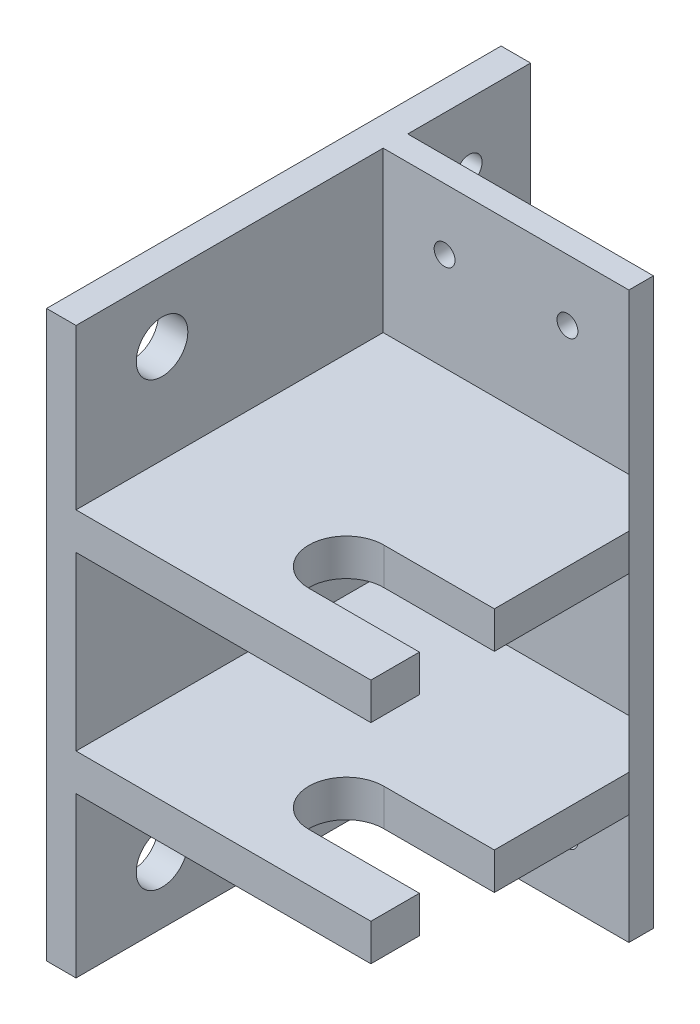
ISO-10303-21;
HEADER;
FILE_DESCRIPTION(('STEP AP214'),'2;1');
FILE_NAME('part.step','',(''),(''),'','','');
FILE_SCHEMA(('AUTOMOTIVE_DESIGN { 1 0 10303 214 1 1 1 1 }'));
ENDSEC;
DATA;
#1=APPLICATION_CONTEXT('core data for automotive mechanical design processes');
#2=APPLICATION_PROTOCOL_DEFINITION('international standard','automotive_design',2000,#1);
#3=PRODUCT_CONTEXT('',#1,'mechanical');
#4=PRODUCT('Part','Part','',(#3));
#5=PRODUCT_RELATED_PRODUCT_CATEGORY('part','',(#4));
#6=PRODUCT_DEFINITION_FORMATION('','',#4);
#7=PRODUCT_DEFINITION_CONTEXT('part definition',#1,'design');
#8=PRODUCT_DEFINITION('design','',#6,#7);
#9=PRODUCT_DEFINITION_SHAPE('','',#8);
#10=(LENGTH_UNIT() NAMED_UNIT(*) SI_UNIT(.MILLI.,.METRE.));
#11=(NAMED_UNIT(*) PLANE_ANGLE_UNIT() SI_UNIT($,.RADIAN.));
#12=(NAMED_UNIT(*) SI_UNIT($,.STERADIAN.) SOLID_ANGLE_UNIT());
#13=UNCERTAINTY_MEASURE_WITH_UNIT(LENGTH_MEASURE(1.E-05),#10,'distance_accuracy_value','');
#14=(GEOMETRIC_REPRESENTATION_CONTEXT(3) GLOBAL_UNCERTAINTY_ASSIGNED_CONTEXT((#13)) GLOBAL_UNIT_ASSIGNED_CONTEXT((#10,
#11,#12)) REPRESENTATION_CONTEXT('',''));
#15=CARTESIAN_POINT('',(0.,0.,0.));
#16=DIRECTION('',(0.,0.,1.));
#17=DIRECTION('',(1.,0.,0.));
#18=AXIS2_PLACEMENT_3D('',#15,#16,#17);
#19=CARTESIAN_POINT('',(120.,-35.,135.));
#20=DIRECTION('',(-1.,0.,0.));
#21=DIRECTION('',(0.,-1.,0.));
#22=AXIS2_PLACEMENT_3D('',#19,#20,#21);
#23=PLANE('',#22);
#24=DIRECTION('',(0.,0.,-1.));
#25=VECTOR('',#24,1.);
#26=CARTESIAN_POINT('',(120.,-50.,135.));
#27=LINE('',#26,#25);
#28=CARTESIAN_POINT('',(120.,-50.,135.));
#29=VERTEX_POINT('',#28);
#30=CARTESIAN_POINT('',(120.,-50.,115.25));
#31=VERTEX_POINT('',#30);
#32=EDGE_CURVE('E318',#29,#31,#27,.T.);
#33=ORIENTED_EDGE('',*,*,#32,.T.);
#34=DIRECTION('',(0.,1.,0.));
#35=VECTOR('',#34,1.);
#36=CARTESIAN_POINT('',(120.,-115.00005,115.25));
#37=LINE('',#36,#35);
#38=CARTESIAN_POINT('',(120.,-35.,115.25));
#39=VERTEX_POINT('',#38);
#40=EDGE_CURVE('E253',#31,#39,#37,.T.);
#41=ORIENTED_EDGE('',*,*,#40,.T.);
#42=DIRECTION('',(0.,0.,1.));
#43=VECTOR('',#42,1.);
#44=CARTESIAN_POINT('',(120.,-35.,135.));
#45=LINE('',#44,#43);
#46=CARTESIAN_POINT('',(120.,-35.,135.));
#47=VERTEX_POINT('',#46);
#48=EDGE_CURVE('E321',#39,#47,#45,.T.);
#49=ORIENTED_EDGE('',*,*,#48,.T.);
#50=DIRECTION('',(0.,-1.,0.));
#51=VECTOR('',#50,1.);
#52=CARTESIAN_POINT('',(120.,-50.,135.));
#53=LINE('',#52,#51);
#54=EDGE_CURVE('E313',#47,#29,#53,.T.);
#55=ORIENTED_EDGE('',*,*,#54,.T.);
#56=EDGE_LOOP('',(#33,#41,#49,#55));
#57=FACE_BOUND('',#56,.T.);
#58=ADVANCED_FACE('F37',(#57),#23,.F.);
#59=CARTESIAN_POINT('',(120.,50.,135.));
#60=DIRECTION('',(-1.,0.,0.));
#61=DIRECTION('',(0.,-1.,0.));
#62=AXIS2_PLACEMENT_3D('',#59,#60,#61);
#63=PLANE('',#62);
#64=DIRECTION('',(0.,0.,-1.));
#65=VECTOR('',#64,1.);
#66=CARTESIAN_POINT('',(120.,35.,135.));
#67=LINE('',#66,#65);
#68=CARTESIAN_POINT('',(120.,35.,135.));
#69=VERTEX_POINT('',#68);
#70=CARTESIAN_POINT('',(120.,35.,115.25));
#71=VERTEX_POINT('',#70);
#72=EDGE_CURVE('E295',#69,#71,#67,.T.);
#73=ORIENTED_EDGE('',*,*,#72,.T.);
#74=DIRECTION('',(0.,1.,0.));
#75=VECTOR('',#74,1.);
#76=CARTESIAN_POINT('',(120.,50.,115.25));
#77=LINE('',#76,#75);
#78=CARTESIAN_POINT('',(120.,50.,115.25));
#79=VERTEX_POINT('',#78);
#80=EDGE_CURVE('E234',#71,#79,#77,.T.);
#81=ORIENTED_EDGE('',*,*,#80,.T.);
#82=DIRECTION('',(0.,0.,1.));
#83=VECTOR('',#82,1.);
#84=CARTESIAN_POINT('',(120.,50.,135.));
#85=LINE('',#84,#83);
#86=CARTESIAN_POINT('',(120.,50.,135.));
#87=VERTEX_POINT('',#86);
#88=EDGE_CURVE('E224',#79,#87,#85,.T.);
#89=ORIENTED_EDGE('',*,*,#88,.T.);
#90=DIRECTION('',(0.,-1.,0.));
#91=VECTOR('',#90,1.);
#92=CARTESIAN_POINT('',(120.,35.,135.));
#93=LINE('',#92,#91);
#94=EDGE_CURVE('E290',#87,#69,#93,.T.);
#95=ORIENTED_EDGE('',*,*,#94,.T.);
#96=EDGE_LOOP('',(#73,#81,#89,#95));
#97=FACE_BOUND('',#96,.T.);
#98=ADVANCED_FACE('F575',(#97),#63,.F.);
#99=CARTESIAN_POINT('',(44.,-199.122877778689,10.));
#100=DIRECTION('',(0.,0.,1.));
#101=DIRECTION('',(1.,0.,0.));
#102=AXIS2_PLACEMENT_3D('',#99,#100,#101);
#103=PLANE('',#102);
#104=CARTESIAN_POINT('',(75.,0.,10.));
#105=DIRECTION('',(0.,0.,1.));
#106=DIRECTION('',(1.,0.,0.));
#107=AXIS2_PLACEMENT_3D('',#104,#105,#106);
#108=CIRCLE('',#107,4.25);
#109=CARTESIAN_POINT('',(79.25,0.,10.));
#110=VERTEX_POINT('',#109);
#111=EDGE_CURVE('E491',#110,#110,#108,.T.);
#112=ORIENTED_EDGE('',*,*,#111,.F.);
#113=EDGE_LOOP('',(#112));
#114=FACE_BOUND('',#113,.T.);
#115=CARTESIAN_POINT('',(25.,0.,10.));
#116=DIRECTION('',(0.,0.,1.));
#117=DIRECTION('',(1.,0.,0.));
#118=AXIS2_PLACEMENT_3D('',#115,#116,#117);
#119=CIRCLE('',#118,4.25);
#120=CARTESIAN_POINT('',(29.25,0.,10.));
#121=VERTEX_POINT('',#120);
#122=EDGE_CURVE('E490',#121,#121,#119,.T.);
#123=ORIENTED_EDGE('',*,*,#122,.F.);
#124=EDGE_LOOP('',(#123));
#125=FACE_BOUND('',#124,.T.);
#126=DIRECTION('',(0.,1.,0.));
#127=VECTOR('',#126,1.);
#128=CARTESIAN_POINT('',(100.,-199.122877778689,10.));
#129=LINE('',#128,#127);
#130=CARTESIAN_POINT('',(100.,-35.,10.));
#131=VERTEX_POINT('',#130);
#132=CARTESIAN_POINT('',(100.,35.,10.));
#133=VERTEX_POINT('',#132);
#134=EDGE_CURVE('E446',#131,#133,#129,.T.);
#135=ORIENTED_EDGE('',*,*,#134,.T.);
#136=DIRECTION('',(-1.,0.,0.));
#137=VECTOR('',#136,1.);
#138=CARTESIAN_POINT('',(120.,35.,10.));
#139=LINE('',#138,#137);
#140=CARTESIAN_POINT('',(0.,35.,10.));
#141=VERTEX_POINT('',#140);
#142=EDGE_CURVE('E307',#133,#141,#139,.T.);
#143=ORIENTED_EDGE('',*,*,#142,.T.);
#144=DIRECTION('',(0.,-1.,0.));
#145=VECTOR('',#144,1.);
#146=CARTESIAN_POINT('',(0.,-199.122877778689,10.));
#147=LINE('',#146,#145);
#148=CARTESIAN_POINT('',(0.,-35.,10.));
#149=VERTEX_POINT('',#148);
#150=EDGE_CURVE('E420',#141,#149,#147,.T.);
#151=ORIENTED_EDGE('',*,*,#150,.T.);
#152=DIRECTION('',(-1.,0.,0.));
#153=VECTOR('',#152,1.);
#154=CARTESIAN_POINT('',(120.,-35.,10.));
#155=LINE('',#154,#153);
#156=EDGE_CURVE('E331',#131,#149,#155,.T.);
#157=ORIENTED_EDGE('',*,*,#156,.F.);
#158=EDGE_LOOP('',(#135,#143,#151,#157));
#159=FACE_BOUND('',#158,.T.);
#160=ADVANCED_FACE('F465',(#114,#125,#159),#103,.T.);
#161=CARTESIAN_POINT('',(75.,90.,10.));
#162=DIRECTION('',(0.,0.,1.));
#163=DIRECTION('',(1.,0.,0.));
#164=AXIS2_PLACEMENT_3D('',#161,#162,#163);
#165=CIRCLE('',#164,4.25);
#166=CARTESIAN_POINT('',(79.25,90.,10.));
#167=VERTEX_POINT('',#166);
#168=EDGE_CURVE('E499',#167,#167,#165,.T.);
#169=ORIENTED_EDGE('',*,*,#168,.F.);
#170=EDGE_LOOP('',(#169));
#171=FACE_BOUND('',#170,.T.);
#172=CARTESIAN_POINT('',(25.,90.,10.));
#173=DIRECTION('',(0.,0.,1.));
#174=DIRECTION('',(1.,0.,0.));
#175=AXIS2_PLACEMENT_3D('',#172,#173,#174);
#176=CIRCLE('',#175,4.25);
#177=CARTESIAN_POINT('',(29.25,90.,10.));
#178=VERTEX_POINT('',#177);
#179=EDGE_CURVE('E495',#178,#178,#176,.T.);
#180=ORIENTED_EDGE('',*,*,#179,.F.);
#181=EDGE_LOOP('',(#180));
#182=FACE_BOUND('',#181,.T.);
#183=CARTESIAN_POINT('',(0.,115.,10.));
#184=VERTEX_POINT('',#183);
#185=CARTESIAN_POINT('',(0.,50.,10.));
#186=VERTEX_POINT('',#185);
#187=EDGE_CURVE('E428',#184,#186,#147,.T.);
#188=ORIENTED_EDGE('',*,*,#187,.T.);
#189=DIRECTION('',(-1.,0.,0.));
#190=VECTOR('',#189,1.);
#191=CARTESIAN_POINT('',(120.,50.,10.));
#192=LINE('',#191,#190);
#193=CARTESIAN_POINT('',(100.,50.,10.));
#194=VERTEX_POINT('',#193);
#195=EDGE_CURVE('E304',#194,#186,#192,.T.);
#196=ORIENTED_EDGE('',*,*,#195,.F.);
#197=CARTESIAN_POINT('',(100.,115.,10.));
#198=VERTEX_POINT('',#197);
#199=EDGE_CURVE('E436',#194,#198,#129,.T.);
#200=ORIENTED_EDGE('',*,*,#199,.T.);
#201=DIRECTION('',(-1.,0.,0.));
#202=VECTOR('',#201,1.);
#203=CARTESIAN_POINT('',(44.,115.,10.));
#204=LINE('',#203,#202);
#205=EDGE_CURVE('E421',#198,#184,#204,.T.);
#206=ORIENTED_EDGE('',*,*,#205,.T.);
#207=EDGE_LOOP('',(#188,#196,#200,#206));
#208=FACE_BOUND('',#207,.T.);
#209=ADVANCED_FACE('F581',(#171,#182,#208),#103,.T.);
#210=CARTESIAN_POINT('',(0.,-199.122877778689,-50.));
#211=DIRECTION('',(-1.,0.,0.));
#212=DIRECTION('',(0.,-1.,0.));
#213=AXIS2_PLACEMENT_3D('',#210,#211,#212);
#214=PLANE('',#213);
#215=DIRECTION('',(0.,0.,-1.));
#216=VECTOR('',#215,1.);
#217=CARTESIAN_POINT('',(0.,35.,135.));
#218=LINE('',#217,#216);
#219=CARTESIAN_POINT('',(0.,35.,135.));
#220=VERTEX_POINT('',#219);
#221=EDGE_CURVE('E289',#220,#141,#218,.T.);
#222=ORIENTED_EDGE('',*,*,#221,.F.);
#223=DIRECTION('',(0.,-1.,0.));
#224=VECTOR('',#223,1.);
#225=CARTESIAN_POINT('',(0.,-199.122877778689,135.));
#226=LINE('',#225,#224);
#227=CARTESIAN_POINT('',(0.,-35.,135.));
#228=VERTEX_POINT('',#227);
#229=EDGE_CURVE('E345',#220,#228,#226,.T.);
#230=ORIENTED_EDGE('',*,*,#229,.T.);
#231=DIRECTION('',(0.,0.,1.));
#232=VECTOR('',#231,1.);
#233=CARTESIAN_POINT('',(0.,-35.,135.));
#234=LINE('',#233,#232);
#235=EDGE_CURVE('E317',#149,#228,#234,.T.);
#236=ORIENTED_EDGE('',*,*,#235,.F.);
#237=ORIENTED_EDGE('',*,*,#150,.F.);
#238=EDGE_LOOP('',(#222,#230,#236,#237));
#239=FACE_BOUND('',#238,.T.);
#240=ADVANCED_FACE('F472',(#239),#214,.F.);
#241=CARTESIAN_POINT('',(0.,90.,100.));
#242=DIRECTION('',(1.,0.,0.));
#243=DIRECTION('',(0.,0.,-1.));
#244=AXIS2_PLACEMENT_3D('',#241,#242,#243);
#245=CIRCLE('',#244,10.5);
#246=CARTESIAN_POINT('',(0.,90.,89.5));
#247=VERTEX_POINT('',#246);
#248=EDGE_CURVE('E246',#247,#247,#245,.T.);
#249=ORIENTED_EDGE('',*,*,#248,.F.);
#250=EDGE_LOOP('',(#249));
#251=FACE_BOUND('',#250,.T.);
#252=DIRECTION('',(0.,0.,1.));
#253=VECTOR('',#252,1.);
#254=CARTESIAN_POINT('',(0.,50.,135.));
#255=LINE('',#254,#253);
#256=CARTESIAN_POINT('',(0.,50.,135.));
#257=VERTEX_POINT('',#256);
#258=EDGE_CURVE('E294',#186,#257,#255,.T.);
#259=ORIENTED_EDGE('',*,*,#258,.F.);
#260=ORIENTED_EDGE('',*,*,#187,.F.);
#261=DIRECTION('',(0.,0.,1.));
#262=VECTOR('',#261,1.);
#263=CARTESIAN_POINT('',(0.,115.,-50.));
#264=LINE('',#263,#262);
#265=CARTESIAN_POINT('',(0.,115.,135.));
#266=VERTEX_POINT('',#265);
#267=EDGE_CURVE('E364',#184,#266,#264,.T.);
#268=ORIENTED_EDGE('',*,*,#267,.T.);
#269=EDGE_CURVE('E342',#266,#257,#226,.T.);
#270=ORIENTED_EDGE('',*,*,#269,.T.);
#271=EDGE_LOOP('',(#259,#260,#268,#270));
#272=FACE_BOUND('',#271,.T.);
#273=ADVANCED_FACE('F579',(#251,#272),#214,.F.);
#274=CARTESIAN_POINT('',(25.,-90.,10.));
#275=DIRECTION('',(0.,0.,1.));
#276=DIRECTION('',(1.,0.,0.));
#277=AXIS2_PLACEMENT_3D('',#274,#275,#276);
#278=CIRCLE('',#277,4.25);
#279=CARTESIAN_POINT('',(29.25,-90.,10.));
#280=VERTEX_POINT('',#279);
#281=EDGE_CURVE('E505',#280,#280,#278,.T.);
#282=ORIENTED_EDGE('',*,*,#281,.F.);
#283=EDGE_LOOP('',(#282));
#284=FACE_BOUND('',#283,.T.);
#285=CARTESIAN_POINT('',(75.,-90.,10.));
#286=DIRECTION('',(0.,0.,1.));
#287=DIRECTION('',(1.,0.,0.));
#288=AXIS2_PLACEMENT_3D('',#285,#286,#287);
#289=CIRCLE('',#288,4.25);
#290=CARTESIAN_POINT('',(79.25,-90.,10.));
#291=VERTEX_POINT('',#290);
#292=EDGE_CURVE('E502',#291,#291,#289,.T.);
#293=ORIENTED_EDGE('',*,*,#292,.F.);
#294=EDGE_LOOP('',(#293));
#295=FACE_BOUND('',#294,.T.);
#296=CARTESIAN_POINT('',(100.,-115.,10.));
#297=VERTEX_POINT('',#296);
#298=CARTESIAN_POINT('',(100.,-50.,10.));
#299=VERTEX_POINT('',#298);
#300=EDGE_CURVE('E424',#297,#299,#129,.T.);
#301=ORIENTED_EDGE('',*,*,#300,.T.);
#302=DIRECTION('',(-1.,0.,0.));
#303=VECTOR('',#302,1.);
#304=CARTESIAN_POINT('',(120.,-50.,10.));
#305=LINE('',#304,#303);
#306=CARTESIAN_POINT('',(0.,-50.,10.));
#307=VERTEX_POINT('',#306);
#308=EDGE_CURVE('E334',#299,#307,#305,.T.);
#309=ORIENTED_EDGE('',*,*,#308,.T.);
#310=CARTESIAN_POINT('',(0.,-115.,10.));
#311=VERTEX_POINT('',#310);
#312=EDGE_CURVE('E418',#307,#311,#147,.T.);
#313=ORIENTED_EDGE('',*,*,#312,.T.);
#314=DIRECTION('',(-1.,0.,0.));
#315=VECTOR('',#314,1.);
#316=CARTESIAN_POINT('',(44.,-115.,10.));
#317=LINE('',#316,#315);
#318=EDGE_CURVE('E432',#297,#311,#317,.T.);
#319=ORIENTED_EDGE('',*,*,#318,.F.);
#320=EDGE_LOOP('',(#301,#309,#313,#319));
#321=FACE_BOUND('',#320,.T.);
#322=ADVANCED_FACE('F539',(#284,#295,#321),#103,.T.);
#323=CARTESIAN_POINT('',(0.,-90.,100.));
#324=DIRECTION('',(1.,0.,0.));
#325=DIRECTION('',(0.,0.,-1.));
#326=AXIS2_PLACEMENT_3D('',#323,#324,#325);
#327=CIRCLE('',#326,10.5);
#328=CARTESIAN_POINT('',(0.,-90.,89.5));
#329=VERTEX_POINT('',#328);
#330=EDGE_CURVE('E486',#329,#329,#327,.T.);
#331=ORIENTED_EDGE('',*,*,#330,.F.);
#332=EDGE_LOOP('',(#331));
#333=FACE_BOUND('',#332,.T.);
#334=DIRECTION('',(0.,0.,-1.));
#335=VECTOR('',#334,1.);
#336=CARTESIAN_POINT('',(0.,-50.,135.));
#337=LINE('',#336,#335);
#338=CARTESIAN_POINT('',(0.,-50.,135.));
#339=VERTEX_POINT('',#338);
#340=EDGE_CURVE('E312',#339,#307,#337,.T.);
#341=ORIENTED_EDGE('',*,*,#340,.F.);
#342=CARTESIAN_POINT('',(0.,-115.,135.));
#343=VERTEX_POINT('',#342);
#344=EDGE_CURVE('E341',#339,#343,#226,.T.);
#345=ORIENTED_EDGE('',*,*,#344,.T.);
#346=DIRECTION('',(0.,0.,1.));
#347=VECTOR('',#346,1.);
#348=CARTESIAN_POINT('',(0.,-115.,-50.));
#349=LINE('',#348,#347);
#350=EDGE_CURVE('E371',#311,#343,#349,.T.);
#351=ORIENTED_EDGE('',*,*,#350,.F.);
#352=ORIENTED_EDGE('',*,*,#312,.F.);
#353=EDGE_LOOP('',(#341,#345,#351,#352));
#354=FACE_BOUND('',#353,.T.);
#355=ADVANCED_FACE('F536',(#333,#354),#214,.F.);
#356=CARTESIAN_POINT('',(44.,115.,10.));
#357=DIRECTION('',(0.,-1.,0.));
#358=DIRECTION('',(1.,0.,0.));
#359=AXIS2_PLACEMENT_3D('',#356,#357,#358);
#360=PLANE('',#359);
#361=DIRECTION('',(-1.,0.,0.));
#362=VECTOR('',#361,1.);
#363=CARTESIAN_POINT('',(44.,115.,0.));
#364=LINE('',#363,#362);
#365=CARTESIAN_POINT('',(100.,115.,0.));
#366=VERTEX_POINT('',#365);
#367=CARTESIAN_POINT('',(0.,115.,0.));
#368=VERTEX_POINT('',#367);
#369=EDGE_CURVE('E377',#366,#368,#364,.T.);
#370=ORIENTED_EDGE('',*,*,#369,.T.);
#371=CARTESIAN_POINT('',(0.,115.,-50.));
#372=VERTEX_POINT('',#371);
#373=EDGE_CURVE('E380',#372,#368,#264,.T.);
#374=ORIENTED_EDGE('',*,*,#373,.F.);
#375=DIRECTION('',(-1.,0.,0.));
#376=VECTOR('',#375,1.);
#377=CARTESIAN_POINT('',(44.,115.,-50.));
#378=LINE('',#377,#376);
#379=CARTESIAN_POINT('',(-12.0000000000001,115.,-50.));
#380=VERTEX_POINT('',#379);
#381=EDGE_CURVE('E357',#372,#380,#378,.T.);
#382=ORIENTED_EDGE('',*,*,#381,.T.);
#383=DIRECTION('',(0.,0.,1.));
#384=VECTOR('',#383,1.);
#385=CARTESIAN_POINT('',(-12.0000000000001,115.,-50.));
#386=LINE('',#385,#384);
#387=CARTESIAN_POINT('',(-12.0000000000001,115.,135.));
#388=VERTEX_POINT('',#387);
#389=EDGE_CURVE('E382',#380,#388,#386,.T.);
#390=ORIENTED_EDGE('',*,*,#389,.T.);
#391=DIRECTION('',(-1.,0.,0.));
#392=VECTOR('',#391,1.);
#393=CARTESIAN_POINT('',(44.,115.,135.));
#394=LINE('',#393,#392);
#395=EDGE_CURVE('E344',#266,#388,#394,.T.);
#396=ORIENTED_EDGE('',*,*,#395,.F.);
#397=ORIENTED_EDGE('',*,*,#267,.F.);
#398=ORIENTED_EDGE('',*,*,#205,.F.);
#399=DIRECTION('',(0.,0.,-1.));
#400=VECTOR('',#399,1.);
#401=CARTESIAN_POINT('',(100.,115.,10.));
#402=LINE('',#401,#400);
#403=EDGE_CURVE('E407',#198,#366,#402,.T.);
#404=ORIENTED_EDGE('',*,*,#403,.T.);
#405=EDGE_LOOP('',(#370,#374,#382,#390,#396,#397,#398,#404));
#406=FACE_BOUND('',#405,.T.);
#407=ADVANCED_FACE('F404',(#406),#360,.F.);
#408=CARTESIAN_POINT('',(44.,-115.,10.));
#409=DIRECTION('',(0.,-1.,0.));
#410=DIRECTION('',(1.,0.,0.));
#411=AXIS2_PLACEMENT_3D('',#408,#409,#410);
#412=PLANE('',#411);
#413=DIRECTION('',(-1.,0.,0.));
#414=VECTOR('',#413,1.);
#415=CARTESIAN_POINT('',(44.,-115.,0.));
#416=LINE('',#415,#414);
#417=CARTESIAN_POINT('',(100.,-115.,0.));
#418=VERTEX_POINT('',#417);
#419=CARTESIAN_POINT('',(0.,-115.,0.));
#420=VERTEX_POINT('',#419);
#421=EDGE_CURVE('E401',#418,#420,#416,.T.);
#422=ORIENTED_EDGE('',*,*,#421,.F.);
#423=DIRECTION('',(0.,0.,-1.));
#424=VECTOR('',#423,1.);
#425=CARTESIAN_POINT('',(100.,-115.,10.));
#426=LINE('',#425,#424);
#427=EDGE_CURVE('E235',#297,#418,#426,.T.);
#428=ORIENTED_EDGE('',*,*,#427,.F.);
#429=ORIENTED_EDGE('',*,*,#318,.T.);
#430=ORIENTED_EDGE('',*,*,#350,.T.);
#431=DIRECTION('',(-1.,0.,0.));
#432=VECTOR('',#431,1.);
#433=CARTESIAN_POINT('',(44.,-115.,135.));
#434=LINE('',#433,#432);
#435=CARTESIAN_POINT('',(-12.0000000000001,-115.,135.));
#436=VERTEX_POINT('',#435);
#437=EDGE_CURVE('E351',#343,#436,#434,.T.);
#438=ORIENTED_EDGE('',*,*,#437,.T.);
#439=DIRECTION('',(0.,0.,1.));
#440=VECTOR('',#439,1.);
#441=CARTESIAN_POINT('',(-12.0000000000001,-115.,-50.));
#442=LINE('',#441,#440);
#443=CARTESIAN_POINT('',(-12.0000000000001,-115.,-50.));
#444=VERTEX_POINT('',#443);
#445=EDGE_CURVE('E367',#444,#436,#442,.T.);
#446=ORIENTED_EDGE('',*,*,#445,.F.);
#447=DIRECTION('',(-1.,0.,0.));
#448=VECTOR('',#447,1.);
#449=CARTESIAN_POINT('',(44.,-115.,-50.));
#450=LINE('',#449,#448);
#451=CARTESIAN_POINT('',(0.,-115.,-50.));
#452=VERTEX_POINT('',#451);
#453=EDGE_CURVE('E362',#452,#444,#450,.T.);
#454=ORIENTED_EDGE('',*,*,#453,.F.);
#455=EDGE_CURVE('E374',#452,#420,#349,.T.);
#456=ORIENTED_EDGE('',*,*,#455,.T.);
#457=EDGE_LOOP('',(#422,#428,#429,#430,#438,#446,#454,#456));
#458=FACE_BOUND('',#457,.T.);
#459=ADVANCED_FACE('F555',(#458),#412,.T.);
#460=CARTESIAN_POINT('',(100.,-199.122877778689,10.));
#461=DIRECTION('',(-1.,0.,0.));
#462=DIRECTION('',(0.,-1.,0.));
#463=AXIS2_PLACEMENT_3D('',#460,#461,#462);
#464=PLANE('',#463);
#465=DIRECTION('',(0.,1.,0.));
#466=VECTOR('',#465,1.);
#467=CARTESIAN_POINT('',(100.,-199.122877778689,0.));
#468=LINE('',#467,#466);
#469=EDGE_CURVE('E415',#418,#366,#468,.T.);
#470=ORIENTED_EDGE('',*,*,#469,.T.);
#471=ORIENTED_EDGE('',*,*,#403,.F.);
#472=ORIENTED_EDGE('',*,*,#199,.F.);
#473=EDGE_CURVE('E451',#133,#194,#129,.T.);
#474=ORIENTED_EDGE('',*,*,#473,.F.);
#475=ORIENTED_EDGE('',*,*,#134,.F.);
#476=DIRECTION('',(0.,1.,0.));
#477=VECTOR('',#476,1.);
#478=CARTESIAN_POINT('',(100.,-199.122877778689,10.));
#479=LINE('',#478,#477);
#480=EDGE_CURVE('E339',#299,#131,#479,.T.);
#481=ORIENTED_EDGE('',*,*,#480,.F.);
#482=ORIENTED_EDGE('',*,*,#300,.F.);
#483=ORIENTED_EDGE('',*,*,#427,.T.);
#484=EDGE_LOOP('',(#470,#471,#472,#474,#475,#481,#482,#483));
#485=FACE_BOUND('',#484,.T.);
#486=ADVANCED_FACE('F461',(#485),#464,.F.);
#487=CARTESIAN_POINT('',(44.,-199.122877778689,0.));
#488=DIRECTION('',(0.,0.,1.));
#489=DIRECTION('',(1.,0.,0.));
#490=AXIS2_PLACEMENT_3D('',#487,#488,#489);
#491=PLANE('',#490);
#492=CARTESIAN_POINT('',(25.,-90.,0.));
#493=DIRECTION('',(0.,0.,1.));
#494=DIRECTION('',(1.,0.,0.));
#495=AXIS2_PLACEMENT_3D('',#492,#493,#494);
#496=CIRCLE('',#495,4.24999999999999);
#497=CARTESIAN_POINT('',(29.25,-90.,0.));
#498=VERTEX_POINT('',#497);
#499=EDGE_CURVE('E503',#498,#498,#496,.T.);
#500=ORIENTED_EDGE('',*,*,#499,.T.);
#501=EDGE_LOOP('',(#500));
#502=FACE_BOUND('',#501,.T.);
#503=CARTESIAN_POINT('',(75.,-90.,0.));
#504=DIRECTION('',(0.,0.,1.));
#505=DIRECTION('',(1.,0.,0.));
#506=AXIS2_PLACEMENT_3D('',#503,#504,#505);
#507=CIRCLE('',#506,4.25);
#508=CARTESIAN_POINT('',(79.25,-90.,0.));
#509=VERTEX_POINT('',#508);
#510=EDGE_CURVE('E500',#509,#509,#507,.T.);
#511=ORIENTED_EDGE('',*,*,#510,.T.);
#512=EDGE_LOOP('',(#511));
#513=FACE_BOUND('',#512,.T.);
#514=CARTESIAN_POINT('',(75.,90.,0.));
#515=DIRECTION('',(0.,0.,1.));
#516=DIRECTION('',(1.,0.,0.));
#517=AXIS2_PLACEMENT_3D('',#514,#515,#516);
#518=CIRCLE('',#517,4.25);
#519=CARTESIAN_POINT('',(79.25,90.,0.));
#520=VERTEX_POINT('',#519);
#521=EDGE_CURVE('E496',#520,#520,#518,.T.);
#522=ORIENTED_EDGE('',*,*,#521,.T.);
#523=EDGE_LOOP('',(#522));
#524=FACE_BOUND('',#523,.T.);
#525=CARTESIAN_POINT('',(25.,90.,0.));
#526=DIRECTION('',(0.,0.,1.));
#527=DIRECTION('',(1.,0.,0.));
#528=AXIS2_PLACEMENT_3D('',#525,#526,#527);
#529=CIRCLE('',#528,4.24999999999999);
#530=CARTESIAN_POINT('',(29.25,90.,0.));
#531=VERTEX_POINT('',#530);
#532=EDGE_CURVE('E492',#531,#531,#529,.T.);
#533=ORIENTED_EDGE('',*,*,#532,.T.);
#534=EDGE_LOOP('',(#533));
#535=FACE_BOUND('',#534,.T.);
#536=CARTESIAN_POINT('',(75.,0.,0.));
#537=DIRECTION('',(0.,0.,1.));
#538=DIRECTION('',(1.,0.,0.));
#539=AXIS2_PLACEMENT_3D('',#536,#537,#538);
#540=CIRCLE('',#539,4.25);
#541=CARTESIAN_POINT('',(79.25,0.,0.));
#542=VERTEX_POINT('',#541);
#543=EDGE_CURVE('E487',#542,#542,#540,.T.);
#544=ORIENTED_EDGE('',*,*,#543,.T.);
#545=EDGE_LOOP('',(#544));
#546=FACE_BOUND('',#545,.T.);
#547=CARTESIAN_POINT('',(25.,0.,0.));
#548=DIRECTION('',(0.,0.,1.));
#549=DIRECTION('',(1.,0.,0.));
#550=AXIS2_PLACEMENT_3D('',#547,#548,#549);
#551=CIRCLE('',#550,4.24999999999999);
#552=CARTESIAN_POINT('',(29.25,0.,0.));
#553=VERTEX_POINT('',#552);
#554=EDGE_CURVE('E528',#553,#553,#551,.T.);
#555=ORIENTED_EDGE('',*,*,#554,.T.);
#556=EDGE_LOOP('',(#555));
#557=FACE_BOUND('',#556,.T.);
#558=ORIENTED_EDGE('',*,*,#369,.F.);
#559=ORIENTED_EDGE('',*,*,#469,.F.);
#560=ORIENTED_EDGE('',*,*,#421,.T.);
#561=DIRECTION('',(0.,-1.,0.));
#562=VECTOR('',#561,1.);
#563=CARTESIAN_POINT('',(0.,-199.122877778689,0.));
#564=LINE('',#563,#562);
#565=EDGE_CURVE('E392',#368,#420,#564,.T.);
#566=ORIENTED_EDGE('',*,*,#565,.F.);
#567=EDGE_LOOP('',(#558,#559,#560,#566));
#568=FACE_BOUND('',#567,.T.);
#569=ADVANCED_FACE('F398',(#502,#513,#524,#535,#546,#557,#568),#491,.F.);
#570=CARTESIAN_POINT('',(0.,90.,-25.));
#571=DIRECTION('',(-1.,0.,0.));
#572=DIRECTION('',(0.,-1.,0.));
#573=AXIS2_PLACEMENT_3D('',#570,#571,#572);
#574=CIRCLE('',#573,5.25000000000001);
#575=CARTESIAN_POINT('',(0.,84.75,-25.));
#576=VERTEX_POINT('',#575);
#577=EDGE_CURVE('E1067',#576,#576,#574,.T.);
#578=ORIENTED_EDGE('',*,*,#577,.T.);
#579=EDGE_LOOP('',(#578));
#580=FACE_BOUND('',#579,.T.);
#581=CARTESIAN_POINT('',(0.,-90.,-25.));
#582=DIRECTION('',(-1.,0.,0.));
#583=DIRECTION('',(0.,-1.,0.));
#584=AXIS2_PLACEMENT_3D('',#581,#582,#583);
#585=CIRCLE('',#584,5.25000000000001);
#586=CARTESIAN_POINT('',(0.,-95.25,-25.));
#587=VERTEX_POINT('',#586);
#588=EDGE_CURVE('E41',#587,#587,#585,.T.);
#589=ORIENTED_EDGE('',*,*,#588,.T.);
#590=EDGE_LOOP('',(#589));
#591=FACE_BOUND('',#590,.T.);
#592=CARTESIAN_POINT('',(0.,0.,-25.));
#593=DIRECTION('',(-1.,0.,0.));
#594=DIRECTION('',(0.,-1.,0.));
#595=AXIS2_PLACEMENT_3D('',#592,#593,#594);
#596=CIRCLE('',#595,5.25000000000001);
#597=CARTESIAN_POINT('',(0.,-5.25000000000009,-25.));
#598=VERTEX_POINT('',#597);
#599=EDGE_CURVE('E511',#598,#598,#596,.T.);
#600=ORIENTED_EDGE('',*,*,#599,.T.);
#601=EDGE_LOOP('',(#600));
#602=FACE_BOUND('',#601,.T.);
#603=ORIENTED_EDGE('',*,*,#373,.T.);
#604=ORIENTED_EDGE('',*,*,#565,.T.);
#605=ORIENTED_EDGE('',*,*,#455,.F.);
#606=DIRECTION('',(0.,-1.,0.));
#607=VECTOR('',#606,1.);
#608=CARTESIAN_POINT('',(0.,-199.122877778689,-50.));
#609=LINE('',#608,#607);
#610=EDGE_CURVE('E354',#372,#452,#609,.T.);
#611=ORIENTED_EDGE('',*,*,#610,.F.);
#612=EDGE_LOOP('',(#603,#604,#605,#611));
#613=FACE_BOUND('',#612,.T.);
#614=ADVANCED_FACE('F390',(#580,#591,#602,#613),#214,.F.);
#615=CARTESIAN_POINT('',(-12.0000000000001,-199.122877778689,-50.));
#616=DIRECTION('',(1.,0.,0.));
#617=DIRECTION('',(0.,0.,-1.));
#618=AXIS2_PLACEMENT_3D('',#615,#616,#617);
#619=PLANE('',#618);
#620=CARTESIAN_POINT('',(-12.,90.,-25.));
#621=DIRECTION('',(-1.,0.,0.));
#622=DIRECTION('',(0.,0.,1.));
#623=AXIS2_PLACEMENT_3D('',#620,#621,#622);
#624=CIRCLE('',#623,5.25000000000002);
#625=CARTESIAN_POINT('',(-12.,90.,-19.75));
#626=VERTEX_POINT('',#625);
#627=EDGE_CURVE('E629',#626,#626,#624,.T.);
#628=ORIENTED_EDGE('',*,*,#627,.F.);
#629=EDGE_LOOP('',(#628));
#630=FACE_BOUND('',#629,.T.);
#631=CARTESIAN_POINT('',(-12.0000000000001,-90.,-25.));
#632=DIRECTION('',(-1.,0.,0.));
#633=DIRECTION('',(0.,0.,1.));
#634=AXIS2_PLACEMENT_3D('',#631,#632,#633);
#635=CIRCLE('',#634,5.25000000000002);
#636=CARTESIAN_POINT('',(-12.0000000000001,-90.,-19.75));
#637=VERTEX_POINT('',#636);
#638=EDGE_CURVE('E633',#637,#637,#635,.T.);
#639=ORIENTED_EDGE('',*,*,#638,.F.);
#640=EDGE_LOOP('',(#639));
#641=FACE_BOUND('',#640,.T.);
#642=CARTESIAN_POINT('',(-12.0000000000001,0.,-25.));
#643=DIRECTION('',(-1.,0.,0.));
#644=DIRECTION('',(0.,0.,1.));
#645=AXIS2_PLACEMENT_3D('',#642,#643,#644);
#646=CIRCLE('',#645,5.25000000000001);
#647=CARTESIAN_POINT('',(-12.0000000000001,0.,-19.75));
#648=VERTEX_POINT('',#647);
#649=EDGE_CURVE('E516',#648,#648,#646,.T.);
#650=ORIENTED_EDGE('',*,*,#649,.F.);
#651=EDGE_LOOP('',(#650));
#652=FACE_BOUND('',#651,.T.);
#653=CARTESIAN_POINT('',(-12.0000000000001,-90.,100.));
#654=DIRECTION('',(1.,0.,0.));
#655=DIRECTION('',(0.,0.,-1.));
#656=AXIS2_PLACEMENT_3D('',#653,#654,#655);
#657=CIRCLE('',#656,10.5);
#658=CARTESIAN_POINT('',(-12.0000000000001,-90.,89.5));
#659=VERTEX_POINT('',#658);
#660=EDGE_CURVE('E483',#659,#659,#657,.T.);
#661=ORIENTED_EDGE('',*,*,#660,.T.);
#662=EDGE_LOOP('',(#661));
#663=FACE_BOUND('',#662,.T.);
#664=CARTESIAN_POINT('',(-12.0000000000001,90.,100.));
#665=DIRECTION('',(1.,0.,0.));
#666=DIRECTION('',(0.,0.,-1.));
#667=AXIS2_PLACEMENT_3D('',#664,#665,#666);
#668=CIRCLE('',#667,10.5);
#669=CARTESIAN_POINT('',(-12.0000000000001,90.,89.5));
#670=VERTEX_POINT('',#669);
#671=EDGE_CURVE('E241',#670,#670,#668,.T.);
#672=ORIENTED_EDGE('',*,*,#671,.T.);
#673=EDGE_LOOP('',(#672));
#674=FACE_BOUND('',#673,.T.);
#675=ORIENTED_EDGE('',*,*,#445,.T.);
#676=DIRECTION('',(0.,1.,0.));
#677=VECTOR('',#676,1.);
#678=CARTESIAN_POINT('',(-12.0000000000001,-199.122877778689,135.));
#679=LINE('',#678,#677);
#680=EDGE_CURVE('E348',#436,#388,#679,.T.);
#681=ORIENTED_EDGE('',*,*,#680,.T.);
#682=ORIENTED_EDGE('',*,*,#389,.F.);
#683=DIRECTION('',(0.,1.,0.));
#684=VECTOR('',#683,1.);
#685=CARTESIAN_POINT('',(-12.0000000000001,-199.122877778689,-50.));
#686=LINE('',#685,#684);
#687=EDGE_CURVE('E360',#444,#380,#686,.T.);
#688=ORIENTED_EDGE('',*,*,#687,.F.);
#689=EDGE_LOOP('',(#675,#681,#682,#688));
#690=FACE_BOUND('',#689,.T.);
#691=ADVANCED_FACE('F618',(#630,#641,#652,#663,#674,#690),#619,.F.);
#692=CARTESIAN_POINT('',(44.,-199.122877778689,-50.));
#693=DIRECTION('',(0.,0.,1.));
#694=DIRECTION('',(1.,0.,0.));
#695=AXIS2_PLACEMENT_3D('',#692,#693,#694);
#696=PLANE('',#695);
#697=ORIENTED_EDGE('',*,*,#610,.T.);
#698=ORIENTED_EDGE('',*,*,#453,.T.);
#699=ORIENTED_EDGE('',*,*,#687,.T.);
#700=ORIENTED_EDGE('',*,*,#381,.F.);
#701=EDGE_LOOP('',(#697,#698,#699,#700));
#702=FACE_BOUND('',#701,.T.);
#703=ADVANCED_FACE('F615',(#702),#696,.F.);
#704=CARTESIAN_POINT('',(44.,-199.122877778689,135.));
#705=DIRECTION('',(0.,0.,1.));
#706=DIRECTION('',(1.,0.,0.));
#707=AXIS2_PLACEMENT_3D('',#704,#705,#706);
#708=PLANE('',#707);
#709=ORIENTED_EDGE('',*,*,#269,.F.);
#710=ORIENTED_EDGE('',*,*,#395,.T.);
#711=ORIENTED_EDGE('',*,*,#680,.F.);
#712=ORIENTED_EDGE('',*,*,#437,.F.);
#713=ORIENTED_EDGE('',*,*,#344,.F.);
#714=DIRECTION('',(-1.,0.,0.));
#715=VECTOR('',#714,1.);
#716=CARTESIAN_POINT('',(120.,-50.,135.));
#717=LINE('',#716,#715);
#718=EDGE_CURVE('E336',#29,#339,#717,.T.);
#719=ORIENTED_EDGE('',*,*,#718,.F.);
#720=ORIENTED_EDGE('',*,*,#54,.F.);
#721=DIRECTION('',(-1.,0.,0.));
#722=VECTOR('',#721,1.);
#723=CARTESIAN_POINT('',(120.,-35.,135.));
#724=LINE('',#723,#722);
#725=EDGE_CURVE('E324',#47,#228,#724,.T.);
#726=ORIENTED_EDGE('',*,*,#725,.T.);
#727=ORIENTED_EDGE('',*,*,#229,.F.);
#728=DIRECTION('',(-1.,0.,0.));
#729=VECTOR('',#728,1.);
#730=CARTESIAN_POINT('',(120.,35.,135.));
#731=LINE('',#730,#729);
#732=EDGE_CURVE('E309',#69,#220,#731,.T.);
#733=ORIENTED_EDGE('',*,*,#732,.F.);
#734=ORIENTED_EDGE('',*,*,#94,.F.);
#735=DIRECTION('',(-1.,0.,0.));
#736=VECTOR('',#735,1.);
#737=CARTESIAN_POINT('',(120.,50.,135.));
#738=LINE('',#737,#736);
#739=EDGE_CURVE('E223',#87,#257,#738,.T.);
#740=ORIENTED_EDGE('',*,*,#739,.T.);
#741=EDGE_LOOP('',(#709,#710,#711,#712,#713,#719,#720,#726,#727,#733,#734,#740));
#742=FACE_BOUND('',#741,.T.);
#743=ADVANCED_FACE('F550',(#742),#708,.T.);
#744=CARTESIAN_POINT('',(120.,-50.,135.));
#745=DIRECTION('',(0.,1.,0.));
#746=DIRECTION('',(-1.,0.,0.));
#747=AXIS2_PLACEMENT_3D('',#744,#745,#746);
#748=PLANE('',#747);
#749=ORIENTED_EDGE('',*,*,#308,.F.);
#750=DIRECTION('',(-0.707106781186549,0.,-0.707106781186546));
#751=VECTOR('',#750,1.);
#752=CARTESIAN_POINT('',(120.,-50.,30.));
#753=LINE('',#752,#751);
#754=CARTESIAN_POINT('',(120.,-50.,30.));
#755=VERTEX_POINT('',#754);
#756=EDGE_CURVE('E12',#299,#755,#753,.F.);
#757=ORIENTED_EDGE('',*,*,#756,.T.);
#758=CARTESIAN_POINT('',(120.,-50.,84.75));
#759=VERTEX_POINT('',#758);
#760=EDGE_CURVE('E316',#759,#755,#27,.T.);
#761=ORIENTED_EDGE('',*,*,#760,.F.);
#762=DIRECTION('',(-1.,0.,0.));
#763=VECTOR('',#762,1.);
#764=CARTESIAN_POINT('',(120.,-50.,84.75));
#765=LINE('',#764,#763);
#766=CARTESIAN_POINT('',(75.,-50.,84.75));
#767=VERTEX_POINT('',#766);
#768=EDGE_CURVE('E268',#759,#767,#765,.T.);
#769=ORIENTED_EDGE('',*,*,#768,.T.);
#770=CARTESIAN_POINT('',(75.,-50.,100.));
#771=DIRECTION('',(0.,1.,0.));
#772=DIRECTION('',(-1.,0.,0.));
#773=AXIS2_PLACEMENT_3D('',#770,#771,#772);
#774=CIRCLE('',#773,15.25);
#775=CARTESIAN_POINT('',(75.,-50.,115.25));
#776=VERTEX_POINT('',#775);
#777=EDGE_CURVE('E286',#767,#776,#774,.T.);
#778=ORIENTED_EDGE('',*,*,#777,.T.);
#779=DIRECTION('',(1.,0.,0.));
#780=VECTOR('',#779,1.);
#781=CARTESIAN_POINT('',(120.,-50.,115.25));
#782=LINE('',#781,#780);
#783=EDGE_CURVE('E277',#776,#31,#782,.T.);
#784=ORIENTED_EDGE('',*,*,#783,.T.);
#785=ORIENTED_EDGE('',*,*,#32,.F.);
#786=ORIENTED_EDGE('',*,*,#718,.T.);
#787=ORIENTED_EDGE('',*,*,#340,.T.);
#788=EDGE_LOOP('',(#749,#757,#761,#769,#778,#784,#785,#786,#787));
#789=FACE_BOUND('',#788,.T.);
#790=ADVANCED_FACE('F546',(#789),#748,.F.);
#791=CARTESIAN_POINT('',(120.,-35.,135.));
#792=DIRECTION('',(0.,-1.,0.));
#793=DIRECTION('',(1.,0.,0.));
#794=AXIS2_PLACEMENT_3D('',#791,#792,#793);
#795=PLANE('',#794);
#796=CARTESIAN_POINT('',(120.,-35.,30.));
#797=VERTEX_POINT('',#796);
#798=CARTESIAN_POINT('',(120.,-35.,84.75));
#799=VERTEX_POINT('',#798);
#800=EDGE_CURVE('E322',#797,#799,#45,.T.);
#801=ORIENTED_EDGE('',*,*,#800,.F.);
#802=DIRECTION('',(0.707106781186549,0.,0.707106781186546));
#803=VECTOR('',#802,1.);
#804=CARTESIAN_POINT('',(120.,-35.,30.));
#805=LINE('',#804,#803);
#806=EDGE_CURVE('E46',#797,#131,#805,.F.);
#807=ORIENTED_EDGE('',*,*,#806,.T.);
#808=ORIENTED_EDGE('',*,*,#156,.T.);
#809=ORIENTED_EDGE('',*,*,#235,.T.);
#810=ORIENTED_EDGE('',*,*,#725,.F.);
#811=ORIENTED_EDGE('',*,*,#48,.F.);
#812=DIRECTION('',(-1.,0.,0.));
#813=VECTOR('',#812,1.);
#814=CARTESIAN_POINT('',(120.,-35.,115.25));
#815=LINE('',#814,#813);
#816=CARTESIAN_POINT('',(75.,-35.,115.25));
#817=VERTEX_POINT('',#816);
#818=EDGE_CURVE('E274',#39,#817,#815,.T.);
#819=ORIENTED_EDGE('',*,*,#818,.T.);
#820=CARTESIAN_POINT('',(75.,-35.,100.));
#821=DIRECTION('',(0.,-1.,0.));
#822=DIRECTION('',(1.,0.,0.));
#823=AXIS2_PLACEMENT_3D('',#820,#821,#822);
#824=CIRCLE('',#823,15.25);
#825=CARTESIAN_POINT('',(75.,-35.,84.75));
#826=VERTEX_POINT('',#825);
#827=EDGE_CURVE('E283',#817,#826,#824,.T.);
#828=ORIENTED_EDGE('',*,*,#827,.T.);
#829=DIRECTION('',(1.,0.,0.));
#830=VECTOR('',#829,1.);
#831=CARTESIAN_POINT('',(120.,-35.,84.75));
#832=LINE('',#831,#830);
#833=EDGE_CURVE('E265',#826,#799,#832,.T.);
#834=ORIENTED_EDGE('',*,*,#833,.T.);
#835=EDGE_LOOP('',(#801,#807,#808,#809,#810,#811,#819,#828,#834));
#836=FACE_BOUND('',#835,.T.);
#837=ADVANCED_FACE('F477',(#836),#795,.F.);
#838=ORIENTED_EDGE('',*,*,#760,.T.);
#839=DIRECTION('',(0.,1.,0.));
#840=VECTOR('',#839,1.);
#841=CARTESIAN_POINT('',(120.,-35.,30.));
#842=LINE('',#841,#840);
#843=EDGE_CURVE('E478',#755,#797,#842,.T.);
#844=ORIENTED_EDGE('',*,*,#843,.T.);
#845=ORIENTED_EDGE('',*,*,#800,.T.);
#846=DIRECTION('',(0.,1.,0.));
#847=VECTOR('',#846,1.);
#848=CARTESIAN_POINT('',(120.,-115.00005,84.75));
#849=LINE('',#848,#847);
#850=EDGE_CURVE('E252',#759,#799,#849,.T.);
#851=ORIENTED_EDGE('',*,*,#850,.F.);
#852=EDGE_LOOP('',(#838,#844,#845,#851));
#853=FACE_BOUND('',#852,.T.);
#854=ADVANCED_FACE('F558',(#853),#23,.F.);
#855=CARTESIAN_POINT('',(120.,35.,135.));
#856=DIRECTION('',(0.,1.,0.));
#857=DIRECTION('',(-1.,0.,0.));
#858=AXIS2_PLACEMENT_3D('',#855,#856,#857);
#859=PLANE('',#858);
#860=ORIENTED_EDGE('',*,*,#142,.F.);
#861=DIRECTION('',(-0.707106781186549,0.,-0.707106781186546));
#862=VECTOR('',#861,1.);
#863=CARTESIAN_POINT('',(120.,35.,30.));
#864=LINE('',#863,#862);
#865=CARTESIAN_POINT('',(120.,35.,30.));
#866=VERTEX_POINT('',#865);
#867=EDGE_CURVE('E459',#133,#866,#864,.F.);
#868=ORIENTED_EDGE('',*,*,#867,.T.);
#869=CARTESIAN_POINT('',(120.,35.,84.75));
#870=VERTEX_POINT('',#869);
#871=EDGE_CURVE('E293',#870,#866,#67,.T.);
#872=ORIENTED_EDGE('',*,*,#871,.F.);
#873=DIRECTION('',(-1.,0.,0.));
#874=VECTOR('',#873,1.);
#875=CARTESIAN_POINT('',(120.,35.,84.75));
#876=LINE('',#875,#874);
#877=CARTESIAN_POINT('',(75.,35.,84.75));
#878=VERTEX_POINT('',#877);
#879=EDGE_CURVE('E233',#870,#878,#876,.T.);
#880=ORIENTED_EDGE('',*,*,#879,.T.);
#881=CARTESIAN_POINT('',(75.,35.,100.));
#882=DIRECTION('',(0.,1.,0.));
#883=DIRECTION('',(-1.,0.,0.));
#884=AXIS2_PLACEMENT_3D('',#881,#882,#883);
#885=CIRCLE('',#884,15.25);
#886=CARTESIAN_POINT('',(75.,35.,115.25));
#887=VERTEX_POINT('',#886);
#888=EDGE_CURVE('E280',#878,#887,#885,.T.);
#889=ORIENTED_EDGE('',*,*,#888,.T.);
#890=DIRECTION('',(1.,0.,0.));
#891=VECTOR('',#890,1.);
#892=CARTESIAN_POINT('',(120.,35.,115.25));
#893=LINE('',#892,#891);
#894=EDGE_CURVE('E271',#887,#71,#893,.T.);
#895=ORIENTED_EDGE('',*,*,#894,.T.);
#896=ORIENTED_EDGE('',*,*,#72,.F.);
#897=ORIENTED_EDGE('',*,*,#732,.T.);
#898=ORIENTED_EDGE('',*,*,#221,.T.);
#899=EDGE_LOOP('',(#860,#868,#872,#880,#889,#895,#896,#897,#898));
#900=FACE_BOUND('',#899,.T.);
#901=ADVANCED_FACE('F468',(#900),#859,.F.);
#902=CARTESIAN_POINT('',(120.,50.,135.));
#903=DIRECTION('',(0.,-1.,0.));
#904=DIRECTION('',(1.,0.,0.));
#905=AXIS2_PLACEMENT_3D('',#902,#903,#904);
#906=PLANE('',#905);
#907=CARTESIAN_POINT('',(120.,50.,30.));
#908=VERTEX_POINT('',#907);
#909=CARTESIAN_POINT('',(120.,50.,84.75));
#910=VERTEX_POINT('',#909);
#911=EDGE_CURVE('E213',#908,#910,#85,.T.);
#912=ORIENTED_EDGE('',*,*,#911,.F.);
#913=DIRECTION('',(0.707106781186549,0.,0.707106781186546));
#914=VECTOR('',#913,1.);
#915=CARTESIAN_POINT('',(120.,50.,30.));
#916=LINE('',#915,#914);
#917=EDGE_CURVE('E458',#908,#194,#916,.F.);
#918=ORIENTED_EDGE('',*,*,#917,.T.);
#919=ORIENTED_EDGE('',*,*,#195,.T.);
#920=ORIENTED_EDGE('',*,*,#258,.T.);
#921=ORIENTED_EDGE('',*,*,#739,.F.);
#922=ORIENTED_EDGE('',*,*,#88,.F.);
#923=DIRECTION('',(1.,0.,0.));
#924=VECTOR('',#923,1.);
#925=CARTESIAN_POINT('',(120.,50.,115.25));
#926=LINE('',#925,#924);
#927=CARTESIAN_POINT('',(75.,50.,115.25));
#928=VERTEX_POINT('',#927);
#929=EDGE_CURVE('E243',#928,#79,#926,.T.);
#930=ORIENTED_EDGE('',*,*,#929,.F.);
#931=CARTESIAN_POINT('',(75.,50.,100.));
#932=DIRECTION('',(0.,1.,0.));
#933=DIRECTION('',(-1.,0.,0.));
#934=AXIS2_PLACEMENT_3D('',#931,#932,#933);
#935=CIRCLE('',#934,15.25);
#936=CARTESIAN_POINT('',(75.,50.,84.75));
#937=VERTEX_POINT('',#936);
#938=EDGE_CURVE('E240',#937,#928,#935,.T.);
#939=ORIENTED_EDGE('',*,*,#938,.F.);
#940=DIRECTION('',(-1.,0.,0.));
#941=VECTOR('',#940,1.);
#942=CARTESIAN_POINT('',(120.,50.,84.75));
#943=LINE('',#942,#941);
#944=EDGE_CURVE('E230',#910,#937,#943,.T.);
#945=ORIENTED_EDGE('',*,*,#944,.F.);
#946=EDGE_LOOP('',(#912,#918,#919,#920,#921,#922,#930,#939,#945));
#947=FACE_BOUND('',#946,.T.);
#948=ADVANCED_FACE('F237',(#947),#906,.F.);
#949=ORIENTED_EDGE('',*,*,#871,.T.);
#950=DIRECTION('',(0.,1.,0.));
#951=VECTOR('',#950,1.);
#952=CARTESIAN_POINT('',(120.,50.,30.));
#953=LINE('',#952,#951);
#954=EDGE_CURVE('E220',#866,#908,#953,.T.);
#955=ORIENTED_EDGE('',*,*,#954,.T.);
#956=ORIENTED_EDGE('',*,*,#911,.T.);
#957=DIRECTION('',(0.,-1.,0.));
#958=VECTOR('',#957,1.);
#959=CARTESIAN_POINT('',(120.,50.,84.75));
#960=LINE('',#959,#958);
#961=EDGE_CURVE('E217',#910,#870,#960,.T.);
#962=ORIENTED_EDGE('',*,*,#961,.T.);
#963=EDGE_LOOP('',(#949,#955,#956,#962));
#964=FACE_BOUND('',#963,.T.);
#965=ADVANCED_FACE('F216',(#964),#63,.F.);
#966=CARTESIAN_POINT('',(120.,-115.00005,115.25));
#967=DIRECTION('',(0.,0.,1.));
#968=DIRECTION('',(1.,0.,0.));
#969=AXIS2_PLACEMENT_3D('',#966,#967,#968);
#970=PLANE('',#969);
#971=DIRECTION('',(0.,1.,0.));
#972=VECTOR('',#971,1.);
#973=CARTESIAN_POINT('',(75.,-115.00005,115.25));
#974=LINE('',#973,#972);
#975=EDGE_CURVE('E257',#887,#928,#974,.T.);
#976=ORIENTED_EDGE('',*,*,#975,.T.);
#977=ORIENTED_EDGE('',*,*,#929,.T.);
#978=ORIENTED_EDGE('',*,*,#80,.F.);
#979=ORIENTED_EDGE('',*,*,#894,.F.);
#980=EDGE_LOOP('',(#976,#977,#978,#979));
#981=FACE_BOUND('',#980,.T.);
#982=ADVANCED_FACE('F657',(#981),#970,.F.);
#983=CARTESIAN_POINT('',(120.,-115.00005,84.75));
#984=DIRECTION('',(0.,0.,-1.));
#985=DIRECTION('',(-1.,0.,0.));
#986=AXIS2_PLACEMENT_3D('',#983,#984,#985);
#987=PLANE('',#986);
#988=ORIENTED_EDGE('',*,*,#961,.F.);
#989=ORIENTED_EDGE('',*,*,#944,.T.);
#990=DIRECTION('',(0.,1.,0.));
#991=VECTOR('',#990,1.);
#992=CARTESIAN_POINT('',(75.,-115.00005,84.75));
#993=LINE('',#992,#991);
#994=EDGE_CURVE('E260',#878,#937,#993,.T.);
#995=ORIENTED_EDGE('',*,*,#994,.F.);
#996=ORIENTED_EDGE('',*,*,#879,.F.);
#997=EDGE_LOOP('',(#988,#989,#995,#996));
#998=FACE_BOUND('',#997,.T.);
#999=ADVANCED_FACE('F228',(#998),#987,.F.);
#1000=CARTESIAN_POINT('',(75.,-115.00005,100.));
#1001=DIRECTION('',(0.,1.,0.));
#1002=DIRECTION('',(-1.,0.,0.));
#1003=AXIS2_PLACEMENT_3D('',#1000,#1001,#1002);
#1004=CYLINDRICAL_SURFACE('',#1003,15.25);
#1005=ORIENTED_EDGE('',*,*,#994,.T.);
#1006=ORIENTED_EDGE('',*,*,#938,.T.);
#1007=ORIENTED_EDGE('',*,*,#975,.F.);
#1008=ORIENTED_EDGE('',*,*,#888,.F.);
#1009=EDGE_LOOP('',(#1005,#1006,#1007,#1008));
#1010=FACE_BOUND('',#1009,.T.);
#1011=ADVANCED_FACE('F660',(#1010),#1004,.F.);
#1012=EDGE_CURVE('E259',#767,#826,#993,.T.);
#1013=ORIENTED_EDGE('',*,*,#1012,.T.);
#1014=ORIENTED_EDGE('',*,*,#827,.F.);
#1015=EDGE_CURVE('E256',#776,#817,#974,.T.);
#1016=ORIENTED_EDGE('',*,*,#1015,.F.);
#1017=ORIENTED_EDGE('',*,*,#777,.F.);
#1018=EDGE_LOOP('',(#1013,#1014,#1016,#1017));
#1019=FACE_BOUND('',#1018,.T.);
#1020=ADVANCED_FACE('F565',(#1019),#1004,.F.);
#1021=ORIENTED_EDGE('',*,*,#1015,.T.);
#1022=ORIENTED_EDGE('',*,*,#818,.F.);
#1023=ORIENTED_EDGE('',*,*,#40,.F.);
#1024=ORIENTED_EDGE('',*,*,#783,.F.);
#1025=EDGE_LOOP('',(#1021,#1022,#1023,#1024));
#1026=FACE_BOUND('',#1025,.T.);
#1027=ADVANCED_FACE('F570',(#1026),#970,.F.);
#1028=ORIENTED_EDGE('',*,*,#850,.T.);
#1029=ORIENTED_EDGE('',*,*,#833,.F.);
#1030=ORIENTED_EDGE('',*,*,#1012,.F.);
#1031=ORIENTED_EDGE('',*,*,#768,.F.);
#1032=EDGE_LOOP('',(#1028,#1029,#1030,#1031));
#1033=FACE_BOUND('',#1032,.T.);
#1034=ADVANCED_FACE('F562',(#1033),#987,.F.);
#1035=CARTESIAN_POINT('',(120.,50.,30.));
#1036=DIRECTION('',(-0.707106781186546,0.,0.707106781186549));
#1037=DIRECTION('',(0.707106781186549,0.,0.707106781186546));
#1038=AXIS2_PLACEMENT_3D('',#1035,#1036,#1037);
#1039=PLANE('',#1038);
#1040=ORIENTED_EDGE('',*,*,#867,.F.);
#1041=ORIENTED_EDGE('',*,*,#473,.T.);
#1042=ORIENTED_EDGE('',*,*,#917,.F.);
#1043=ORIENTED_EDGE('',*,*,#954,.F.);
#1044=EDGE_LOOP('',(#1040,#1041,#1042,#1043));
#1045=FACE_BOUND('',#1044,.T.);
#1046=ADVANCED_FACE('F457',(#1045),#1039,.F.);
#1047=CARTESIAN_POINT('',(120.,-35.,30.));
#1048=DIRECTION('',(-0.707106781186546,0.,0.707106781186549));
#1049=DIRECTION('',(0.707106781186549,0.,0.707106781186546));
#1050=AXIS2_PLACEMENT_3D('',#1047,#1048,#1049);
#1051=PLANE('',#1050);
#1052=ORIENTED_EDGE('',*,*,#756,.F.);
#1053=ORIENTED_EDGE('',*,*,#480,.T.);
#1054=ORIENTED_EDGE('',*,*,#806,.F.);
#1055=ORIENTED_EDGE('',*,*,#843,.F.);
#1056=EDGE_LOOP('',(#1052,#1053,#1054,#1055));
#1057=FACE_BOUND('',#1056,.T.);
#1058=ADVANCED_FACE('F39',(#1057),#1051,.F.);
#1059=CARTESIAN_POINT('',(0.,90.,100.));
#1060=DIRECTION('',(1.,0.,0.));
#1061=DIRECTION('',(0.,0.,-1.));
#1062=AXIS2_PLACEMENT_3D('',#1059,#1060,#1061);
#1063=CYLINDRICAL_SURFACE('',#1062,10.5);
#1064=ORIENTED_EDGE('',*,*,#248,.T.);
#1065=EDGE_LOOP('',(#1064));
#1066=FACE_BOUND('',#1065,.T.);
#1067=ORIENTED_EDGE('',*,*,#671,.F.);
#1068=EDGE_LOOP('',(#1067));
#1069=FACE_BOUND('',#1068,.T.);
#1070=ADVANCED_FACE('F642',(#1066,#1069),#1063,.F.);
#1071=CARTESIAN_POINT('',(0.,-90.,100.));
#1072=DIRECTION('',(1.,0.,0.));
#1073=DIRECTION('',(0.,0.,-1.));
#1074=AXIS2_PLACEMENT_3D('',#1071,#1072,#1073);
#1075=CYLINDRICAL_SURFACE('',#1074,10.5);
#1076=ORIENTED_EDGE('',*,*,#330,.T.);
#1077=EDGE_LOOP('',(#1076));
#1078=FACE_BOUND('',#1077,.T.);
#1079=ORIENTED_EDGE('',*,*,#660,.F.);
#1080=EDGE_LOOP('',(#1079));
#1081=FACE_BOUND('',#1080,.T.);
#1082=ADVANCED_FACE('F533',(#1078,#1081),#1075,.F.);
#1083=CARTESIAN_POINT('',(25.,0.,10.));
#1084=DIRECTION('',(0.,0.,1.));
#1085=DIRECTION('',(1.,0.,0.));
#1086=AXIS2_PLACEMENT_3D('',#1083,#1084,#1085);
#1087=CYLINDRICAL_SURFACE('',#1086,4.24999999999999);
#1088=ORIENTED_EDGE('',*,*,#122,.T.);
#1089=EDGE_LOOP('',(#1088));
#1090=FACE_BOUND('',#1089,.T.);
#1091=ORIENTED_EDGE('',*,*,#554,.F.);
#1092=EDGE_LOOP('',(#1091));
#1093=FACE_BOUND('',#1092,.T.);
#1094=ADVANCED_FACE('F650',(#1090,#1093),#1087,.F.);
#1095=CARTESIAN_POINT('',(75.,0.,10.));
#1096=DIRECTION('',(0.,0.,1.));
#1097=DIRECTION('',(1.,0.,0.));
#1098=AXIS2_PLACEMENT_3D('',#1095,#1096,#1097);
#1099=CYLINDRICAL_SURFACE('',#1098,4.25);
#1100=ORIENTED_EDGE('',*,*,#111,.T.);
#1101=EDGE_LOOP('',(#1100));
#1102=FACE_BOUND('',#1101,.T.);
#1103=ORIENTED_EDGE('',*,*,#543,.F.);
#1104=EDGE_LOOP('',(#1103));
#1105=FACE_BOUND('',#1104,.T.);
#1106=ADVANCED_FACE('F803',(#1102,#1105),#1099,.F.);
#1107=CARTESIAN_POINT('',(25.,90.,10.));
#1108=DIRECTION('',(0.,0.,1.));
#1109=DIRECTION('',(1.,0.,0.));
#1110=AXIS2_PLACEMENT_3D('',#1107,#1108,#1109);
#1111=CYLINDRICAL_SURFACE('',#1110,4.24999999999999);
#1112=ORIENTED_EDGE('',*,*,#179,.T.);
#1113=EDGE_LOOP('',(#1112));
#1114=FACE_BOUND('',#1113,.T.);
#1115=ORIENTED_EDGE('',*,*,#532,.F.);
#1116=EDGE_LOOP('',(#1115));
#1117=FACE_BOUND('',#1116,.T.);
#1118=ADVANCED_FACE('F793',(#1114,#1117),#1111,.F.);
#1119=CARTESIAN_POINT('',(75.,90.,10.));
#1120=DIRECTION('',(0.,0.,1.));
#1121=DIRECTION('',(1.,0.,0.));
#1122=AXIS2_PLACEMENT_3D('',#1119,#1120,#1121);
#1123=CYLINDRICAL_SURFACE('',#1122,4.25);
#1124=ORIENTED_EDGE('',*,*,#168,.T.);
#1125=EDGE_LOOP('',(#1124));
#1126=FACE_BOUND('',#1125,.T.);
#1127=ORIENTED_EDGE('',*,*,#521,.F.);
#1128=EDGE_LOOP('',(#1127));
#1129=FACE_BOUND('',#1128,.T.);
#1130=ADVANCED_FACE('F783',(#1126,#1129),#1123,.F.);
#1131=CARTESIAN_POINT('',(75.,-90.,10.));
#1132=DIRECTION('',(0.,0.,1.));
#1133=DIRECTION('',(1.,0.,0.));
#1134=AXIS2_PLACEMENT_3D('',#1131,#1132,#1133);
#1135=CYLINDRICAL_SURFACE('',#1134,4.25);
#1136=ORIENTED_EDGE('',*,*,#292,.T.);
#1137=EDGE_LOOP('',(#1136));
#1138=FACE_BOUND('',#1137,.T.);
#1139=ORIENTED_EDGE('',*,*,#510,.F.);
#1140=EDGE_LOOP('',(#1139));
#1141=FACE_BOUND('',#1140,.T.);
#1142=ADVANCED_FACE('F773',(#1138,#1141),#1135,.F.);
#1143=CARTESIAN_POINT('',(25.,-90.,10.));
#1144=DIRECTION('',(0.,0.,1.));
#1145=DIRECTION('',(1.,0.,0.));
#1146=AXIS2_PLACEMENT_3D('',#1143,#1144,#1145);
#1147=CYLINDRICAL_SURFACE('',#1146,4.24999999999999);
#1148=ORIENTED_EDGE('',*,*,#281,.T.);
#1149=EDGE_LOOP('',(#1148));
#1150=FACE_BOUND('',#1149,.T.);
#1151=ORIENTED_EDGE('',*,*,#499,.F.);
#1152=EDGE_LOOP('',(#1151));
#1153=FACE_BOUND('',#1152,.T.);
#1154=ADVANCED_FACE('F736',(#1150,#1153),#1147,.F.);
#1155=CARTESIAN_POINT('',(-12.0000000000001,0.,-25.));
#1156=DIRECTION('',(-1.,0.,0.));
#1157=DIRECTION('',(0.,0.,1.));
#1158=AXIS2_PLACEMENT_3D('',#1155,#1156,#1157);
#1159=CYLINDRICAL_SURFACE('',#1158,5.25000000000001);
#1160=ORIENTED_EDGE('',*,*,#649,.T.);
#1161=EDGE_LOOP('',(#1160));
#1162=FACE_BOUND('',#1161,.T.);
#1163=ORIENTED_EDGE('',*,*,#599,.F.);
#1164=EDGE_LOOP('',(#1163));
#1165=FACE_BOUND('',#1164,.T.);
#1166=ADVANCED_FACE('F730',(#1162,#1165),#1159,.F.);
#1167=CARTESIAN_POINT('',(-12.0000000000001,-90.,-25.));
#1168=DIRECTION('',(-1.,0.,0.));
#1169=DIRECTION('',(0.,0.,1.));
#1170=AXIS2_PLACEMENT_3D('',#1167,#1168,#1169);
#1171=CYLINDRICAL_SURFACE('',#1170,5.25000000000001);
#1172=ORIENTED_EDGE('',*,*,#638,.T.);
#1173=EDGE_LOOP('',(#1172));
#1174=FACE_BOUND('',#1173,.T.);
#1175=ORIENTED_EDGE('',*,*,#588,.F.);
#1176=EDGE_LOOP('',(#1175));
#1177=FACE_BOUND('',#1176,.T.);
#1178=ADVANCED_FACE('F735',(#1174,#1177),#1171,.F.);
#1179=CARTESIAN_POINT('',(-12.,90.,-25.));
#1180=DIRECTION('',(-1.,0.,0.));
#1181=DIRECTION('',(0.,0.,1.));
#1182=AXIS2_PLACEMENT_3D('',#1179,#1180,#1181);
#1183=CYLINDRICAL_SURFACE('',#1182,5.25000000000001);
#1184=ORIENTED_EDGE('',*,*,#627,.T.);
#1185=EDGE_LOOP('',(#1184));
#1186=FACE_BOUND('',#1185,.T.);
#1187=ORIENTED_EDGE('',*,*,#577,.F.);
#1188=EDGE_LOOP('',(#1187));
#1189=FACE_BOUND('',#1188,.T.);
#1190=ADVANCED_FACE('F748',(#1186,#1189),#1183,.F.);
#1191=CLOSED_SHELL('',(#58,#98,#160,#209,#240,#273,#322,#355,#407,#459,#486,#569,#614,#691,#703,
#743,#790,#837,#854,#901,#948,#965,#982,#999,#1011,#1020,#1027,#1034,#1046,#1058,#1070,#1082,
#1094,#1106,#1118,#1130,#1142,#1154,#1166,#1178,#1190));
#1192=MANIFOLD_SOLID_BREP('B2',#1191);
#1193=ADVANCED_BREP_SHAPE_REPRESENTATION('',(#18,#1192),#14);
#1194=SHAPE_DEFINITION_REPRESENTATION(#9,#1193);
ENDSEC;
END-ISO-10303-21;
